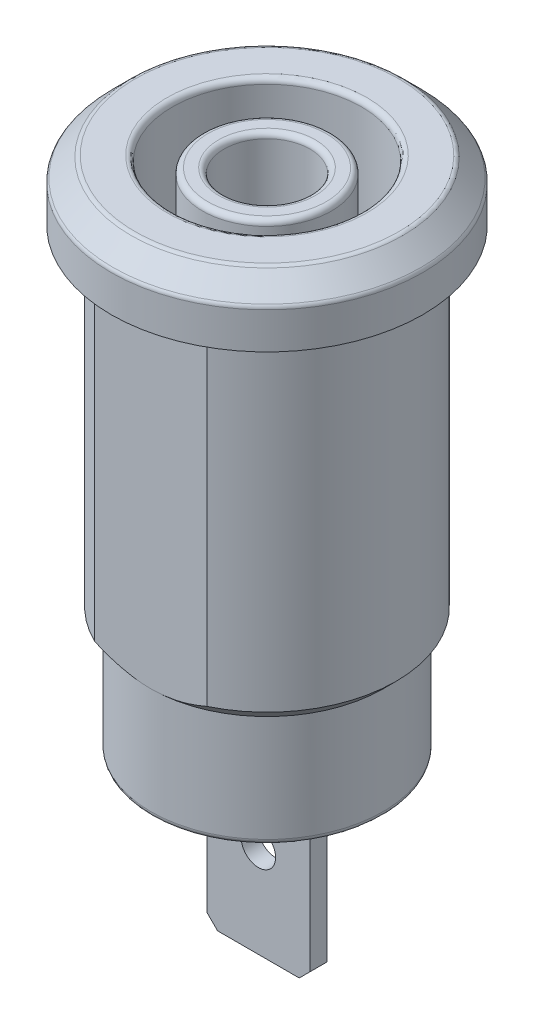
ISO-10303-21;
HEADER;
FILE_DESCRIPTION(('STEP AP214'),'2;1');
FILE_NAME('part.step','',(''),(''),'','','');
FILE_SCHEMA(('AUTOMOTIVE_DESIGN { 1 0 10303 214 1 1 1 1 }'));
ENDSEC;
DATA;
#1=APPLICATION_CONTEXT('core data for automotive mechanical design processes');
#2=APPLICATION_PROTOCOL_DEFINITION('international standard','automotive_design',2000,#1);
#3=PRODUCT_CONTEXT('',#1,'mechanical');
#4=PRODUCT('Part','Part','',(#3));
#5=PRODUCT_RELATED_PRODUCT_CATEGORY('part','',(#4));
#6=PRODUCT_DEFINITION_FORMATION('','',#4);
#7=PRODUCT_DEFINITION_CONTEXT('part definition',#1,'design');
#8=PRODUCT_DEFINITION('design','',#6,#7);
#9=PRODUCT_DEFINITION_SHAPE('','',#8);
#10=(LENGTH_UNIT() NAMED_UNIT(*) SI_UNIT(.MILLI.,.METRE.));
#11=(NAMED_UNIT(*) PLANE_ANGLE_UNIT() SI_UNIT($,.RADIAN.));
#12=(NAMED_UNIT(*) SI_UNIT($,.STERADIAN.) SOLID_ANGLE_UNIT());
#13=UNCERTAINTY_MEASURE_WITH_UNIT(LENGTH_MEASURE(1.E-05),#10,'distance_accuracy_value','');
#14=(GEOMETRIC_REPRESENTATION_CONTEXT(3) GLOBAL_UNCERTAINTY_ASSIGNED_CONTEXT((#13)) GLOBAL_UNIT_ASSIGNED_CONTEXT((#10,
#11,#12)) REPRESENTATION_CONTEXT('',''));
#15=CARTESIAN_POINT('',(0.,0.,0.));
#16=DIRECTION('',(0.,0.,1.));
#17=DIRECTION('',(1.,0.,0.));
#18=AXIS2_PLACEMENT_3D('',#15,#16,#17);
#19=CARTESIAN_POINT('',(0.,-24.,0.));
#20=DIRECTION('',(0.,-1.,0.));
#21=DIRECTION('',(0.,0.,-1.));
#22=AXIS2_PLACEMENT_3D('',#19,#20,#21);
#23=CYLINDRICAL_SURFACE('',#22,6.);
#24=DIRECTION('',(0.,-1.,0.));
#25=VECTOR('',#24,1.);
#26=CARTESIAN_POINT('',(2.6153393661244,17.911157620954,-5.4));
#27=LINE('',#26,#25);
#28=CARTESIAN_POINT('',(2.6153393661244,-2.8,-5.4));
#29=VERTEX_POINT('',#28);
#30=CARTESIAN_POINT('',(2.6153393661244,-18.2,-5.4));
#31=VERTEX_POINT('',#30);
#32=EDGE_CURVE('E155',#29,#31,#27,.T.);
#33=ORIENTED_EDGE('',*,*,#32,.F.);
#34=CARTESIAN_POINT('',(0.,-2.8,0.));
#35=DIRECTION('',(0.,-1.,0.));
#36=DIRECTION('',(0.,0.,-1.));
#37=AXIS2_PLACEMENT_3D('',#34,#35,#36);
#38=CIRCLE('',#37,6.);
#39=CARTESIAN_POINT('',(2.6153393661244,-2.8,5.4));
#40=VERTEX_POINT('',#39);
#41=EDGE_CURVE('E150',#29,#40,#38,.T.);
#42=ORIENTED_EDGE('',*,*,#41,.T.);
#43=DIRECTION('',(0.,-1.,0.));
#44=VECTOR('',#43,1.);
#45=CARTESIAN_POINT('',(2.6153393661244,17.911157620954,5.4));
#46=LINE('',#45,#44);
#47=CARTESIAN_POINT('',(2.6153393661244,-18.2,5.4));
#48=VERTEX_POINT('',#47);
#49=EDGE_CURVE('E132',#40,#48,#46,.T.);
#50=ORIENTED_EDGE('',*,*,#49,.T.);
#51=CARTESIAN_POINT('',(0.,-18.2,0.));
#52=DIRECTION('',(0.,-1.,0.));
#53=DIRECTION('',(0.,0.,-1.));
#54=AXIS2_PLACEMENT_3D('',#51,#52,#53);
#55=CIRCLE('',#54,6.);
#56=EDGE_CURVE('E161',#31,#48,#55,.T.);
#57=ORIENTED_EDGE('',*,*,#56,.F.);
#58=EDGE_LOOP('',(#33,#42,#50,#57));
#59=FACE_BOUND('',#58,.T.);
#60=ADVANCED_FACE('F48',(#59),#23,.T.);
#61=DIRECTION('',(0.,-1.,0.));
#62=VECTOR('',#61,1.);
#63=CARTESIAN_POINT('',(-2.6153393661244,17.911157620954,-5.4));
#64=LINE('',#63,#62);
#65=CARTESIAN_POINT('',(-2.6153393661244,-2.8,-5.4));
#66=VERTEX_POINT('',#65);
#67=CARTESIAN_POINT('',(-2.6153393661244,-18.2,-5.4));
#68=VERTEX_POINT('',#67);
#69=EDGE_CURVE('E683',#66,#68,#64,.T.);
#70=ORIENTED_EDGE('',*,*,#69,.T.);
#71=CARTESIAN_POINT('',(-2.6153393661244,-18.2,5.4));
#72=VERTEX_POINT('',#71);
#73=EDGE_CURVE('E292',#72,#68,#55,.T.);
#74=ORIENTED_EDGE('',*,*,#73,.F.);
#75=DIRECTION('',(0.,-1.,0.));
#76=VECTOR('',#75,1.);
#77=CARTESIAN_POINT('',(-2.6153393661244,17.911157620954,5.4));
#78=LINE('',#77,#76);
#79=CARTESIAN_POINT('',(-2.6153393661244,-2.8,5.4));
#80=VERTEX_POINT('',#79);
#81=EDGE_CURVE('E143',#80,#72,#78,.T.);
#82=ORIENTED_EDGE('',*,*,#81,.F.);
#83=EDGE_CURVE('E152',#80,#66,#38,.T.);
#84=ORIENTED_EDGE('',*,*,#83,.T.);
#85=EDGE_LOOP('',(#70,#74,#82,#84));
#86=FACE_BOUND('',#85,.T.);
#87=ADVANCED_FACE('F384',(#86),#23,.T.);
#88=CARTESIAN_POINT('',(0.,-18.2,0.));
#89=DIRECTION('',(0.,1.,0.));
#90=DIRECTION('',(0.,0.,1.));
#91=AXIS2_PLACEMENT_3D('',#88,#89,#90);
#92=CONICAL_SURFACE('',#91,6.,0.785398163397453);
#93=CARTESIAN_POINT('',(7.88051799855966,-14.6468558094404,-5.4));
#94=CARTESIAN_POINT('',(7.74017221020052,-14.7626199716313,-5.4));
#95=CARTESIAN_POINT('',(7.59934854294888,-14.8778077851178,-5.4));
#96=CARTESIAN_POINT('',(7.31659914119185,-15.1068319058643,-5.4));
#97=CARTESIAN_POINT('',(7.17467336980966,-15.2206681675757,-5.4));
#98=CARTESIAN_POINT('',(6.88940206289736,-15.446925967279,-5.4));
#99=CARTESIAN_POINT('',(6.74605495489742,-15.5593455277286,-5.4));
#100=CARTESIAN_POINT('',(6.45794610624799,-15.7823531493775,-5.4));
#101=CARTESIAN_POINT('',(6.31318435892511,-15.8929412019301,-5.4));
#102=CARTESIAN_POINT('',(5.86985497728603,-16.2265139061073,-5.4));
#103=CARTESIAN_POINT('',(5.56871545140075,-16.4461307639529,-5.4));
#104=CARTESIAN_POINT('',(5.11042409538005,-16.7659850586157,-5.4));
#105=CARTESIAN_POINT('',(4.95659525168662,-16.8709876096033,-5.4));
#106=CARTESIAN_POINT('',(4.64637357979973,-17.0771263411528,-5.4));
#107=CARTESIAN_POINT('',(4.48998089378888,-17.1782627350901,-5.4));
#108=CARTESIAN_POINT('',(4.13062218153672,-17.4031402386419,-5.4));
#109=CARTESIAN_POINT('',(3.9267261894353,-17.5254069715341,-5.4));
#110=CARTESIAN_POINT('',(3.51329540566441,-17.759947729394,-5.4));
#111=CARTESIAN_POINT('',(3.30376234083575,-17.8722247701783,-5.4));
#112=CARTESIAN_POINT('',(2.87913300479671,-18.0831702072468,-5.4));
#113=CARTESIAN_POINT('',(2.66406812203023,-18.1819011021161,-5.4));
#114=CARTESIAN_POINT('',(2.22685748405029,-18.3622499956522,-5.4));
#115=CARTESIAN_POINT('',(2.0047156813708,-18.4438773602718,-5.4));
#116=CARTESIAN_POINT('',(1.62249657198403,-18.5634776025891,-5.4));
#117=CARTESIAN_POINT('',(1.46421343755746,-18.6071667328493,-5.4));
#118=CARTESIAN_POINT('',(1.14472131497074,-18.6821833970467,-5.4));
#119=CARTESIAN_POINT('',(0.983512735568519,-18.7135126442687,-5.4));
#120=CARTESIAN_POINT('',(0.659439725938091,-18.7622348650963,-5.4));
#121=CARTESIAN_POINT('',(0.496581268896233,-18.7796670061468,-5.4));
#122=CARTESIAN_POINT('',(0.169946440350035,-18.7997849861937,-5.4));
#123=CARTESIAN_POINT('',(0.00617010289977787,-18.802471368691,-5.4));
#124=CARTESIAN_POINT('',(-0.321096828992566,-18.7929379954228,-5.4));
#125=CARTESIAN_POINT('',(-0.484587003353726,-18.7807040560021,-5.4));
#126=CARTESIAN_POINT('',(-0.809860093596026,-18.7419987942841,-5.4));
#127=CARTESIAN_POINT('',(-0.971642859631856,-18.7155262328008,-5.4));
#128=CARTESIAN_POINT('',(-1.29306988062594,-18.6495780552557,-5.4));
#129=CARTESIAN_POINT('',(-1.45270504228862,-18.6100587244377,-5.4));
#130=CARTESIAN_POINT('',(-1.76870930749127,-18.5197367339798,-5.4));
#131=CARTESIAN_POINT('',(-1.92507838643421,-18.4689339893975,-5.4));
#132=CARTESIAN_POINT('',(-2.26242054167032,-18.3476962147427,-5.4));
#133=CARTESIAN_POINT('',(-2.44270982974381,-18.2753715460032,-5.4));
#134=CARTESIAN_POINT('',(-2.79863515154502,-18.1199753063737,-5.4));
#135=CARTESIAN_POINT('',(-2.97426897972715,-18.0368987476117,-5.4));
#136=CARTESIAN_POINT('',(-3.32150616692736,-17.8620299132164,-5.4));
#137=CARTESIAN_POINT('',(-3.49310169661547,-17.7702222086563,-5.4));
#138=CARTESIAN_POINT('',(-3.83239379345227,-17.5797630721267,-5.4));
#139=CARTESIAN_POINT('',(-4.00009091979759,-17.4811126298852,-5.4));
#140=CARTESIAN_POINT('',(-4.33318972627573,-17.2776423519917,-5.4));
#141=CARTESIAN_POINT('',(-4.49856925673257,-17.1727864262386,-5.4));
#142=CARTESIAN_POINT('',(-4.82637211814564,-16.958558008334,-5.4));
#143=CARTESIAN_POINT('',(-4.9887953626857,-16.849185384458,-5.4));
#144=CARTESIAN_POINT('',(-5.3109328562108,-16.6268606702301,-5.4));
#145=CARTESIAN_POINT('',(-5.47064958346763,-16.5139121602079,-5.4));
#146=CARTESIAN_POINT('',(-5.7878903728073,-16.2849749965794,-5.4));
#147=CARTESIAN_POINT('',(-5.94541437741838,-16.168986263517,-5.4));
#148=CARTESIAN_POINT('',(-6.25403088070918,-15.9378723762329,-5.4));
#149=CARTESIAN_POINT('',(-6.40517755457747,-15.8228194223752,-5.4));
#150=CARTESIAN_POINT('',(-6.70592588927033,-15.590684955648,-5.4));
#151=CARTESIAN_POINT('',(-6.8555274022988,-15.4736032515427,-5.4));
#152=CARTESIAN_POINT('',(-7.15168747834554,-15.239054723029,-5.4));
#153=CARTESIAN_POINT('',(-7.29826132740584,-15.1216071707167,-5.4));
#154=CARTESIAN_POINT('',(-7.5902323752724,-14.8852624613367,-5.4));
#155=CARTESIAN_POINT('',(-7.73562959259385,-14.7663653271533,-5.4));
#156=CARTESIAN_POINT('',(-7.88051799855967,-14.6468558094404,-5.4));
#157=B_SPLINE_CURVE_WITH_KNOTS('',3,(#93,#94,#95,#96,#97,#98,#99,#100,#101,#102,#103,#104,#105,
#106,#107,#108,#109,#110,#111,#112,#113,#114,#115,#116,#117,#118,#119,#120,#121,#122,#123,#124,
#125,#126,#127,#128,#129,#130,#131,#132,#133,#134,#135,#136,#137,#138,#139,#140,#141,#142,#143,
#144,#145,#146,#147,#148,#149,#150,#151,#152,#153,#154,#155,#156),.UNSPECIFIED.,.F.,.F.,(4,2,2,
2,2,2,2,2,2,2,2,2,2,2,2,2,2,2,2,2,2,2,2,2,2,2,2,2,2,2,2,4),(0.,0.545788995403366,
1.0915963324797,1.63809595955851,2.18459816593152,3.30245890012273,3.8611620670288,
4.41983435413523,5.13285329767226,5.8456562502883,6.5550511737132,7.26405660886146,
7.75624619720894,8.24836753592784,8.7390969329762,9.22980824253735,9.72098639916365,
10.2122073098999,10.7050911085736,11.1979786178446,11.7802986021396,12.3628897033444,
12.9465301471928,13.5300863490771,14.1174544290453,14.704839651078,15.2916542824447,
15.8784842655065,16.4483264707753,17.0182226864039,17.5816847034062,18.145137836599),.UNSPECIFIED.);
#158=CARTESIAN_POINT('',(0.,-18.8,-5.4));
#159=VERTEX_POINT('',#158);
#160=EDGE_CURVE('E71',#31,#159,#157,.T.);
#161=ORIENTED_EDGE('',*,*,#160,.F.);
#162=ORIENTED_EDGE('',*,*,#56,.T.);
#163=CARTESIAN_POINT('',(-7.88051799855966,-14.6468558094404,5.4));
#164=CARTESIAN_POINT('',(-7.74017221020052,-14.7626199716313,5.4));
#165=CARTESIAN_POINT('',(-7.59934854294887,-14.8778077851178,5.4));
#166=CARTESIAN_POINT('',(-7.31659914119185,-15.1068319058643,5.4));
#167=CARTESIAN_POINT('',(-7.17467336980965,-15.2206681675757,5.4));
#168=CARTESIAN_POINT('',(-6.88940206289736,-15.446925967279,5.4));
#169=CARTESIAN_POINT('',(-6.74605495489742,-15.5593455277286,5.4));
#170=CARTESIAN_POINT('',(-6.45794610624799,-15.7823531493775,5.4));
#171=CARTESIAN_POINT('',(-6.31318435892511,-15.8929412019301,5.4));
#172=CARTESIAN_POINT('',(-5.86985497728603,-16.2265139061073,5.4));
#173=CARTESIAN_POINT('',(-5.56871545140075,-16.4461307639529,5.4));
#174=CARTESIAN_POINT('',(-5.11042409538005,-16.7659850586157,5.4));
#175=CARTESIAN_POINT('',(-4.95659525168662,-16.8709876096033,5.4));
#176=CARTESIAN_POINT('',(-4.64637357979973,-17.0771263411528,5.4));
#177=CARTESIAN_POINT('',(-4.48998089378888,-17.1782627350902,5.4));
#178=CARTESIAN_POINT('',(-4.13062218153671,-17.4031402386419,5.4));
#179=CARTESIAN_POINT('',(-3.9267261894353,-17.5254069715341,5.4));
#180=CARTESIAN_POINT('',(-3.51329540566441,-17.759947729394,5.4));
#181=CARTESIAN_POINT('',(-3.30376234083574,-17.8722247701783,5.4));
#182=CARTESIAN_POINT('',(-2.87913300479671,-18.0831702072468,5.4));
#183=CARTESIAN_POINT('',(-2.66406812203022,-18.1819011021161,5.4));
#184=CARTESIAN_POINT('',(-2.22685748405029,-18.3622499956522,5.4));
#185=CARTESIAN_POINT('',(-2.0047156813708,-18.4438773602718,5.4));
#186=CARTESIAN_POINT('',(-1.62249657198403,-18.5634776025891,5.4));
#187=CARTESIAN_POINT('',(-1.46421343755746,-18.6071667328493,5.4));
#188=CARTESIAN_POINT('',(-1.14472131497074,-18.6821833970467,5.4));
#189=CARTESIAN_POINT('',(-0.983512735568518,-18.7135126442687,5.4));
#190=CARTESIAN_POINT('',(-0.659439725938091,-18.7622348650963,5.4));
#191=CARTESIAN_POINT('',(-0.496581268896233,-18.7796670061468,5.4));
#192=CARTESIAN_POINT('',(-0.169946440350035,-18.7997849861937,5.4));
#193=CARTESIAN_POINT('',(-0.00617010289977773,-18.802471368691,5.4));
#194=CARTESIAN_POINT('',(0.321096828992566,-18.7929379954228,5.4));
#195=CARTESIAN_POINT('',(0.484587003353726,-18.7807040560021,5.4));
#196=CARTESIAN_POINT('',(0.809860093596027,-18.7419987942841,5.4));
#197=CARTESIAN_POINT('',(0.971642859631856,-18.7155262328008,5.4));
#198=CARTESIAN_POINT('',(1.29306988062594,-18.6495780552557,5.4));
#199=CARTESIAN_POINT('',(1.45270504228862,-18.6100587244377,5.4));
#200=CARTESIAN_POINT('',(1.76870930749127,-18.5197367339798,5.4));
#201=CARTESIAN_POINT('',(1.92507838643421,-18.4689339893975,5.4));
#202=CARTESIAN_POINT('',(2.26242054167032,-18.3476962147427,5.4));
#203=CARTESIAN_POINT('',(2.44270982974381,-18.2753715460032,5.4));
#204=CARTESIAN_POINT('',(2.79863515154502,-18.1199753063737,5.4));
#205=CARTESIAN_POINT('',(2.97426897972715,-18.0368987476117,5.4));
#206=CARTESIAN_POINT('',(3.32150616692736,-17.8620299132164,5.4));
#207=CARTESIAN_POINT('',(3.49310169661547,-17.7702222086563,5.4));
#208=CARTESIAN_POINT('',(3.83239379345227,-17.5797630721267,5.4));
#209=CARTESIAN_POINT('',(4.00009091979759,-17.4811126298852,5.4));
#210=CARTESIAN_POINT('',(4.33318972627573,-17.2776423519917,5.4));
#211=CARTESIAN_POINT('',(4.49856925673257,-17.1727864262386,5.4));
#212=CARTESIAN_POINT('',(4.82637211814564,-16.958558008334,5.4));
#213=CARTESIAN_POINT('',(4.9887953626857,-16.849185384458,5.4));
#214=CARTESIAN_POINT('',(5.3109328562108,-16.6268606702301,5.4));
#215=CARTESIAN_POINT('',(5.47064958346763,-16.5139121602079,5.4));
#216=CARTESIAN_POINT('',(5.7878903728073,-16.2849749965794,5.4));
#217=CARTESIAN_POINT('',(5.94541437741838,-16.168986263517,5.4));
#218=CARTESIAN_POINT('',(6.25403088070918,-15.9378723762329,5.4));
#219=CARTESIAN_POINT('',(6.40517755457747,-15.8228194223752,5.4));
#220=CARTESIAN_POINT('',(6.70592588927032,-15.590684955648,5.4));
#221=CARTESIAN_POINT('',(6.8555274022988,-15.4736032515427,5.4));
#222=CARTESIAN_POINT('',(7.15168747834553,-15.239054723029,5.4));
#223=CARTESIAN_POINT('',(7.29826132740583,-15.1216071707167,5.4));
#224=CARTESIAN_POINT('',(7.59023237527239,-14.8852624613367,5.4));
#225=CARTESIAN_POINT('',(7.73562959259385,-14.7663653271533,5.4));
#226=CARTESIAN_POINT('',(7.88051799855966,-14.6468558094404,5.4));
#227=B_SPLINE_CURVE_WITH_KNOTS('',3,(#163,#164,#165,#166,#167,#168,#169,#170,#171,#172,#173,
#174,#175,#176,#177,#178,#179,#180,#181,#182,#183,#184,#185,#186,#187,#188,#189,#190,#191,#192,
#193,#194,#195,#196,#197,#198,#199,#200,#201,#202,#203,#204,#205,#206,#207,#208,#209,#210,#211,
#212,#213,#214,#215,#216,#217,#218,#219,#220,#221,#222,#223,#224,#225,#226),.UNSPECIFIED.,.F.,
.F.,(4,2,2,2,2,2,2,2,2,2,2,2,2,2,2,2,2,2,2,2,2,2,2,2,2,2,2,2,2,2,2,4),(0.,0.545788995403366,
1.0915963324797,1.63809595955851,2.18459816593151,3.30245890012272,3.8611620670288,
4.41983435413523,5.13285329767226,5.8456562502883,6.5550511737132,7.26405660886146,
7.75624619720893,8.24836753592783,8.7390969329762,9.22980824253734,9.72098639916364,
10.2122073098999,10.7050911085736,11.1979786178446,11.7802986021396,12.3628897033444,
12.9465301471928,13.5300863490771,14.1174544290453,14.704839651078,15.2916542824447,
15.8784842655065,16.4483264707753,17.0182226864039,17.5816847034062,18.145137836599),.UNSPECIFIED.);
#228=CARTESIAN_POINT('',(0.,-18.8,5.4));
#229=VERTEX_POINT('',#228);
#230=EDGE_CURVE('E137',#229,#48,#227,.T.);
#231=ORIENTED_EDGE('',*,*,#230,.F.);
#232=CARTESIAN_POINT('',(0.,-18.8,0.));
#233=DIRECTION('',(0.,-1.,0.));
#234=DIRECTION('',(0.,0.,-1.));
#235=AXIS2_PLACEMENT_3D('',#232,#233,#234);
#236=CIRCLE('',#235,5.4);
#237=EDGE_CURVE('E290',#159,#229,#236,.T.);
#238=ORIENTED_EDGE('',*,*,#237,.F.);
#239=EDGE_LOOP('',(#161,#162,#231,#238));
#240=FACE_BOUND('',#239,.T.);
#241=ADVANCED_FACE('F299',(#240),#92,.T.);
#242=EDGE_CURVE('E301',#159,#68,#157,.T.);
#243=ORIENTED_EDGE('',*,*,#242,.F.);
#244=EDGE_CURVE('E239',#229,#159,#236,.T.);
#245=ORIENTED_EDGE('',*,*,#244,.F.);
#246=EDGE_CURVE('E63',#72,#229,#227,.T.);
#247=ORIENTED_EDGE('',*,*,#246,.F.);
#248=ORIENTED_EDGE('',*,*,#73,.T.);
#249=EDGE_LOOP('',(#243,#245,#247,#248));
#250=FACE_BOUND('',#249,.T.);
#251=ADVANCED_FACE('F227',(#250),#92,.T.);
#252=CARTESIAN_POINT('',(-5.4,-24.,0.));
#253=DIRECTION('',(0.,1.,0.));
#254=DIRECTION('',(0.,0.,1.));
#255=AXIS2_PLACEMENT_3D('',#252,#253,#254);
#256=PLANE('',#255);
#257=CARTESIAN_POINT('',(0.,-24.,0.));
#258=DIRECTION('',(0.,1.,0.));
#259=DIRECTION('',(0.,0.,1.));
#260=AXIS2_PLACEMENT_3D('',#257,#258,#259);
#261=CIRCLE('',#260,5.15);
#262=CARTESIAN_POINT('',(0.,-24.,5.15));
#263=VERTEX_POINT('',#262);
#264=EDGE_CURVE('E209',#263,#263,#261,.F.);
#265=ORIENTED_EDGE('',*,*,#264,.T.);
#266=EDGE_LOOP('',(#265));
#267=FACE_BOUND('',#266,.T.);
#268=DIRECTION('',(0.,0.,-1.));
#269=VECTOR('',#268,1.);
#270=CARTESIAN_POINT('',(-2.4,-24.,0.4));
#271=LINE('',#270,#269);
#272=CARTESIAN_POINT('',(-2.4,-24.,0.4));
#273=VERTEX_POINT('',#272);
#274=CARTESIAN_POINT('',(-2.4,-24.,-0.4));
#275=VERTEX_POINT('',#274);
#276=EDGE_CURVE('E230',#273,#275,#271,.T.);
#277=ORIENTED_EDGE('',*,*,#276,.F.);
#278=DIRECTION('',(-1.,0.,0.));
#279=VECTOR('',#278,1.);
#280=CARTESIAN_POINT('',(2.4,-24.,0.4));
#281=LINE('',#280,#279);
#282=CARTESIAN_POINT('',(2.4,-24.,0.4));
#283=VERTEX_POINT('',#282);
#284=EDGE_CURVE('E233',#283,#273,#281,.T.);
#285=ORIENTED_EDGE('',*,*,#284,.F.);
#286=DIRECTION('',(0.,0.,-1.));
#287=VECTOR('',#286,1.);
#288=CARTESIAN_POINT('',(2.4,-24.,0.4));
#289=LINE('',#288,#287);
#290=CARTESIAN_POINT('',(2.4,-24.,-0.4));
#291=VERTEX_POINT('',#290);
#292=EDGE_CURVE('E270',#283,#291,#289,.T.);
#293=ORIENTED_EDGE('',*,*,#292,.T.);
#294=DIRECTION('',(-1.,0.,0.));
#295=VECTOR('',#294,1.);
#296=CARTESIAN_POINT('',(2.4,-24.,-0.4));
#297=LINE('',#296,#295);
#298=EDGE_CURVE('E236',#291,#275,#297,.T.);
#299=ORIENTED_EDGE('',*,*,#298,.T.);
#300=EDGE_LOOP('',(#277,#285,#293,#299));
#301=FACE_BOUND('',#300,.T.);
#302=ADVANCED_FACE('F223',(#267,#301),#256,.F.);
#303=CARTESIAN_POINT('',(-4.4,0.,0.));
#304=DIRECTION('',(0.,-1.,0.));
#305=DIRECTION('',(0.,0.,-1.));
#306=AXIS2_PLACEMENT_3D('',#303,#304,#305);
#307=PLANE('',#306);
#308=CARTESIAN_POINT('',(0.,0.,0.));
#309=DIRECTION('',(0.,-1.,0.));
#310=DIRECTION('',(0.,0.,-1.));
#311=AXIS2_PLACEMENT_3D('',#308,#309,#310);
#312=CIRCLE('',#311,4.65);
#313=CARTESIAN_POINT('',(0.,0.,-4.65));
#314=VERTEX_POINT('',#313);
#315=EDGE_CURVE('E194',#314,#314,#312,.T.);
#316=ORIENTED_EDGE('',*,*,#315,.T.);
#317=EDGE_LOOP('',(#316));
#318=FACE_BOUND('',#317,.T.);
#319=CARTESIAN_POINT('',(0.,0.,0.));
#320=DIRECTION('',(0.,-1.,0.));
#321=DIRECTION('',(0.,0.,-1.));
#322=AXIS2_PLACEMENT_3D('',#319,#320,#321);
#323=CIRCLE('',#322,6.14644660940673);
#324=CARTESIAN_POINT('',(0.,0.,-6.14644660940673));
#325=VERTEX_POINT('',#324);
#326=EDGE_CURVE('E191',#325,#325,#323,.F.);
#327=ORIENTED_EDGE('',*,*,#326,.T.);
#328=EDGE_LOOP('',(#327));
#329=FACE_BOUND('',#328,.T.);
#330=ADVANCED_FACE('F226',(#318,#329),#307,.F.);
#331=CARTESIAN_POINT('',(0.,0.,0.));
#332=DIRECTION('',(0.,-1.,0.));
#333=DIRECTION('',(0.,0.,-1.));
#334=AXIS2_PLACEMENT_3D('',#331,#332,#333);
#335=CONICAL_SURFACE('',#334,6.25000000000001,0.785398163397445);
#336=CARTESIAN_POINT('',(0.,-0.0732233047033648,0.));
#337=DIRECTION('',(0.,1.,0.));
#338=DIRECTION('',(0.,0.,1.));
#339=AXIS2_PLACEMENT_3D('',#336,#337,#338);
#340=CIRCLE('',#339,6.32322330470337);
#341=CARTESIAN_POINT('',(0.,-0.0732233047033648,6.32322330470337));
#342=VERTEX_POINT('',#341);
#343=EDGE_CURVE('E200',#342,#342,#340,.F.);
#344=ORIENTED_EDGE('',*,*,#343,.T.);
#345=EDGE_LOOP('',(#344));
#346=FACE_BOUND('',#345,.T.);
#347=CARTESIAN_POINT('',(0.,-0.926776695296637,0.));
#348=DIRECTION('',(0.,1.,0.));
#349=DIRECTION('',(0.,0.,1.));
#350=AXIS2_PLACEMENT_3D('',#347,#348,#349);
#351=CIRCLE('',#350,7.17677669529664);
#352=CARTESIAN_POINT('',(0.,-0.926776695296637,7.17677669529664));
#353=VERTEX_POINT('',#352);
#354=EDGE_CURVE('E197',#353,#353,#351,.T.);
#355=ORIENTED_EDGE('',*,*,#354,.T.);
#356=EDGE_LOOP('',(#355));
#357=FACE_BOUND('',#356,.T.);
#358=ADVANCED_FACE('F392',(#346,#357),#335,.T.);
#359=CARTESIAN_POINT('',(0.,-24.,0.));
#360=DIRECTION('',(0.,-1.,0.));
#361=DIRECTION('',(0.,0.,-1.));
#362=AXIS2_PLACEMENT_3D('',#359,#360,#361);
#363=CYLINDRICAL_SURFACE('',#362,7.25);
#364=CARTESIAN_POINT('',(0.,-1.10355339059327,0.));
#365=DIRECTION('',(0.,1.,0.));
#366=DIRECTION('',(0.,0.,1.));
#367=AXIS2_PLACEMENT_3D('',#364,#365,#366);
#368=CIRCLE('',#367,7.25);
#369=CARTESIAN_POINT('',(0.,-1.10355339059327,7.25));
#370=VERTEX_POINT('',#369);
#371=EDGE_CURVE('E12',#370,#370,#368,.F.);
#372=ORIENTED_EDGE('',*,*,#371,.T.);
#373=EDGE_LOOP('',(#372));
#374=FACE_BOUND('',#373,.T.);
#375=CARTESIAN_POINT('',(0.,-2.8,0.));
#376=DIRECTION('',(0.,-1.,0.));
#377=DIRECTION('',(0.,0.,-1.));
#378=AXIS2_PLACEMENT_3D('',#375,#376,#377);
#379=CIRCLE('',#378,7.25);
#380=CARTESIAN_POINT('',(0.,-2.8,-7.25));
#381=VERTEX_POINT('',#380);
#382=EDGE_CURVE('E156',#381,#381,#379,.T.);
#383=ORIENTED_EDGE('',*,*,#382,.F.);
#384=EDGE_LOOP('',(#383));
#385=FACE_BOUND('',#384,.T.);
#386=ADVANCED_FACE('F381',(#374,#385),#363,.T.);
#387=CARTESIAN_POINT('',(-7.25,-2.8,0.));
#388=DIRECTION('',(0.,1.,0.));
#389=DIRECTION('',(0.,0.,1.));
#390=AXIS2_PLACEMENT_3D('',#387,#388,#389);
#391=PLANE('',#390);
#392=ORIENTED_EDGE('',*,*,#41,.F.);
#393=DIRECTION('',(1.,0.,0.));
#394=VECTOR('',#393,1.);
#395=CARTESIAN_POINT('',(-2.6153393661244,-2.8,-5.4));
#396=LINE('',#395,#394);
#397=EDGE_CURVE('E142',#66,#29,#396,.T.);
#398=ORIENTED_EDGE('',*,*,#397,.F.);
#399=ORIENTED_EDGE('',*,*,#83,.F.);
#400=DIRECTION('',(-1.,0.,0.));
#401=VECTOR('',#400,1.);
#402=CARTESIAN_POINT('',(2.6153393661244,-2.8,5.4));
#403=LINE('',#402,#401);
#404=EDGE_CURVE('E135',#40,#80,#403,.T.);
#405=ORIENTED_EDGE('',*,*,#404,.F.);
#406=EDGE_LOOP('',(#392,#398,#399,#405));
#407=FACE_BOUND('',#406,.T.);
#408=ORIENTED_EDGE('',*,*,#382,.T.);
#409=EDGE_LOOP('',(#408));
#410=FACE_BOUND('',#409,.T.);
#411=ADVANCED_FACE('F148',(#407,#410),#391,.F.);
#412=CARTESIAN_POINT('',(0.,-24.,0.));
#413=DIRECTION('',(0.,-1.,0.));
#414=DIRECTION('',(0.,0.,-1.));
#415=AXIS2_PLACEMENT_3D('',#412,#413,#414);
#416=CYLINDRICAL_SURFACE('',#415,5.4);
#417=CARTESIAN_POINT('',(0.,-23.75,0.));
#418=DIRECTION('',(0.,1.,0.));
#419=DIRECTION('',(0.,0.,1.));
#420=AXIS2_PLACEMENT_3D('',#417,#418,#419);
#421=CIRCLE('',#420,5.4);
#422=CARTESIAN_POINT('',(0.,-23.75,5.4));
#423=VERTEX_POINT('',#422);
#424=EDGE_CURVE('E56',#423,#423,#421,.T.);
#425=ORIENTED_EDGE('',*,*,#424,.T.);
#426=EDGE_LOOP('',(#425));
#427=FACE_BOUND('',#426,.T.);
#428=ORIENTED_EDGE('',*,*,#244,.T.);
#429=ORIENTED_EDGE('',*,*,#237,.T.);
#430=EDGE_LOOP('',(#428,#429));
#431=FACE_BOUND('',#430,.T.);
#432=ADVANCED_FACE('F214',(#427,#431),#416,.T.);
#433=CARTESIAN_POINT('',(0.,-21.1547005383792,0.));
#434=DIRECTION('',(0.,1.,0.));
#435=DIRECTION('',(0.,0.,1.));
#436=AXIS2_PLACEMENT_3D('',#433,#434,#435);
#437=CONICAL_SURFACE('',#436,0.,1.0471975511966);
#438=CARTESIAN_POINT('',(0.,-20.0721687836487,0.));
#439=DIRECTION('',(0.,1.,0.));
#440=DIRECTION('',(0.,0.,1.));
#441=AXIS2_PLACEMENT_3D('',#438,#439,#440);
#442=CIRCLE('',#441,1.875);
#443=CARTESIAN_POINT('',(0.,-20.0721687836487,1.875));
#444=VERTEX_POINT('',#443);
#445=EDGE_CURVE('E170',#444,#444,#442,.T.);
#446=ORIENTED_EDGE('',*,*,#445,.T.);
#447=EDGE_LOOP('',(#446));
#448=FACE_BOUND('',#447,.T.);
#449=CARTESIAN_POINT('',(0.,-21.1547005383792,0.));
#450=VERTEX_POINT('',#449);
#451=VERTEX_LOOP('',#450);
#452=FACE_BOUND('',#451,.T.);
#453=ADVANCED_FACE('F372',(#448,#452),#437,.F.);
#454=CARTESIAN_POINT('',(0.,-24.,0.));
#455=DIRECTION('',(0.,-1.,0.));
#456=DIRECTION('',(0.,0.,-1.));
#457=AXIS2_PLACEMENT_3D('',#454,#455,#456);
#458=CYLINDRICAL_SURFACE('',#457,2.);
#459=CARTESIAN_POINT('',(0.,-19.8556624327026,0.));
#460=DIRECTION('',(0.,-1.,0.));
#461=DIRECTION('',(0.,0.,-1.));
#462=AXIS2_PLACEMENT_3D('',#459,#460,#461);
#463=CIRCLE('',#462,2.);
#464=CARTESIAN_POINT('',(0.,-19.8556624327026,-2.));
#465=VERTEX_POINT('',#464);
#466=EDGE_CURVE('E167',#465,#465,#463,.T.);
#467=ORIENTED_EDGE('',*,*,#466,.T.);
#468=EDGE_LOOP('',(#467));
#469=FACE_BOUND('',#468,.T.);
#470=CARTESIAN_POINT('',(0.,-0.750000000000001,0.));
#471=DIRECTION('',(0.,-1.,0.));
#472=DIRECTION('',(0.,0.,-1.));
#473=AXIS2_PLACEMENT_3D('',#470,#471,#472);
#474=CIRCLE('',#473,2.);
#475=CARTESIAN_POINT('',(0.,-0.750000000000001,-2.));
#476=VERTEX_POINT('',#475);
#477=EDGE_CURVE('E159',#476,#476,#474,.F.);
#478=ORIENTED_EDGE('',*,*,#477,.T.);
#479=EDGE_LOOP('',(#478));
#480=FACE_BOUND('',#479,.T.);
#481=ADVANCED_FACE('F368',(#469,#480),#458,.F.);
#482=CARTESIAN_POINT('',(-3.,-0.5,0.));
#483=DIRECTION('',(0.,-1.,0.));
#484=DIRECTION('',(0.,0.,-1.));
#485=AXIS2_PLACEMENT_3D('',#482,#483,#484);
#486=PLANE('',#485);
#487=CARTESIAN_POINT('',(0.,-0.5,0.));
#488=DIRECTION('',(0.,-1.,0.));
#489=DIRECTION('',(0.,0.,-1.));
#490=AXIS2_PLACEMENT_3D('',#487,#488,#489);
#491=CIRCLE('',#490,2.25);
#492=CARTESIAN_POINT('',(0.,-0.5,-2.25));
#493=VERTEX_POINT('',#492);
#494=EDGE_CURVE('E206',#493,#493,#491,.T.);
#495=ORIENTED_EDGE('',*,*,#494,.T.);
#496=EDGE_LOOP('',(#495));
#497=FACE_BOUND('',#496,.T.);
#498=CARTESIAN_POINT('',(0.,-0.5,0.));
#499=DIRECTION('',(0.,-1.,0.));
#500=DIRECTION('',(0.,0.,-1.));
#501=AXIS2_PLACEMENT_3D('',#498,#499,#500);
#502=CIRCLE('',#501,2.75);
#503=CARTESIAN_POINT('',(0.,-0.5,-2.75));
#504=VERTEX_POINT('',#503);
#505=EDGE_CURVE('E203',#504,#504,#502,.F.);
#506=ORIENTED_EDGE('',*,*,#505,.T.);
#507=EDGE_LOOP('',(#506));
#508=FACE_BOUND('',#507,.T.);
#509=ADVANCED_FACE('F364',(#497,#508),#486,.F.);
#510=CARTESIAN_POINT('',(0.,-24.,0.));
#511=DIRECTION('',(0.,-1.,0.));
#512=DIRECTION('',(0.,0.,-1.));
#513=AXIS2_PLACEMENT_3D('',#510,#511,#512);
#514=CYLINDRICAL_SURFACE('',#513,3.);
#515=CARTESIAN_POINT('',(0.,-21.25,0.));
#516=DIRECTION('',(0.,-1.,0.));
#517=DIRECTION('',(0.,0.,-1.));
#518=AXIS2_PLACEMENT_3D('',#515,#516,#517);
#519=CIRCLE('',#518,3.);
#520=CARTESIAN_POINT('',(0.,-21.25,-3.));
#521=VERTEX_POINT('',#520);
#522=EDGE_CURVE('E182',#521,#521,#519,.F.);
#523=ORIENTED_EDGE('',*,*,#522,.T.);
#524=EDGE_LOOP('',(#523));
#525=FACE_BOUND('',#524,.T.);
#526=CARTESIAN_POINT('',(0.,-0.750000000000001,0.));
#527=DIRECTION('',(0.,-1.,0.));
#528=DIRECTION('',(0.,0.,-1.));
#529=AXIS2_PLACEMENT_3D('',#526,#527,#528);
#530=CIRCLE('',#529,3.);
#531=CARTESIAN_POINT('',(0.,-0.750000000000001,-3.));
#532=VERTEX_POINT('',#531);
#533=EDGE_CURVE('E179',#532,#532,#530,.T.);
#534=ORIENTED_EDGE('',*,*,#533,.T.);
#535=EDGE_LOOP('',(#534));
#536=FACE_BOUND('',#535,.T.);
#537=ADVANCED_FACE('F360',(#525,#536),#514,.T.);
#538=CARTESIAN_POINT('',(-4.4,-21.5,0.));
#539=DIRECTION('',(0.,-1.,0.));
#540=DIRECTION('',(0.,0.,-1.));
#541=AXIS2_PLACEMENT_3D('',#538,#539,#540);
#542=PLANE('',#541);
#543=CARTESIAN_POINT('',(0.,-21.5,0.));
#544=DIRECTION('',(0.,-1.,0.));
#545=DIRECTION('',(0.,0.,-1.));
#546=AXIS2_PLACEMENT_3D('',#543,#544,#545);
#547=CIRCLE('',#546,3.25);
#548=CARTESIAN_POINT('',(0.,-21.5,-3.25));
#549=VERTEX_POINT('',#548);
#550=EDGE_CURVE('E176',#549,#549,#547,.T.);
#551=ORIENTED_EDGE('',*,*,#550,.T.);
#552=EDGE_LOOP('',(#551));
#553=FACE_BOUND('',#552,.T.);
#554=CARTESIAN_POINT('',(0.,-21.5,0.));
#555=DIRECTION('',(0.,-1.,0.));
#556=DIRECTION('',(0.,0.,-1.));
#557=AXIS2_PLACEMENT_3D('',#554,#555,#556);
#558=CIRCLE('',#557,4.15);
#559=CARTESIAN_POINT('',(0.,-21.5,-4.15));
#560=VERTEX_POINT('',#559);
#561=EDGE_CURVE('E173',#560,#560,#558,.F.);
#562=ORIENTED_EDGE('',*,*,#561,.T.);
#563=EDGE_LOOP('',(#562));
#564=FACE_BOUND('',#563,.T.);
#565=ADVANCED_FACE('F356',(#553,#564),#542,.F.);
#566=CARTESIAN_POINT('',(0.,-24.,0.));
#567=DIRECTION('',(0.,-1.,0.));
#568=DIRECTION('',(0.,0.,-1.));
#569=AXIS2_PLACEMENT_3D('',#566,#567,#568);
#570=CYLINDRICAL_SURFACE('',#569,4.4);
#571=CARTESIAN_POINT('',(0.,-21.25,0.));
#572=DIRECTION('',(0.,-1.,0.));
#573=DIRECTION('',(0.,0.,-1.));
#574=AXIS2_PLACEMENT_3D('',#571,#572,#573);
#575=CIRCLE('',#574,4.4);
#576=CARTESIAN_POINT('',(0.,-21.25,-4.4));
#577=VERTEX_POINT('',#576);
#578=EDGE_CURVE('E188',#577,#577,#575,.T.);
#579=ORIENTED_EDGE('',*,*,#578,.T.);
#580=EDGE_LOOP('',(#579));
#581=FACE_BOUND('',#580,.T.);
#582=CARTESIAN_POINT('',(0.,-0.25,0.));
#583=DIRECTION('',(0.,-1.,0.));
#584=DIRECTION('',(0.,0.,-1.));
#585=AXIS2_PLACEMENT_3D('',#582,#583,#584);
#586=CIRCLE('',#585,4.4);
#587=CARTESIAN_POINT('',(0.,-0.25,-4.4));
#588=VERTEX_POINT('',#587);
#589=EDGE_CURVE('E185',#588,#588,#586,.F.);
#590=ORIENTED_EDGE('',*,*,#589,.T.);
#591=EDGE_LOOP('',(#590));
#592=FACE_BOUND('',#591,.T.);
#593=ADVANCED_FACE('F333',(#581,#592),#570,.F.);
#594=CARTESIAN_POINT('',(0.,0.,0.4));
#595=DIRECTION('',(0.,0.,1.));
#596=DIRECTION('',(1.,0.,0.));
#597=AXIS2_PLACEMENT_3D('',#594,#595,#596);
#598=PLANE('',#597);
#599=ORIENTED_EDGE('',*,*,#284,.T.);
#600=DIRECTION('',(0.,-1.,0.));
#601=VECTOR('',#600,1.);
#602=CARTESIAN_POINT('',(-2.4,-24.,0.4));
#603=LINE('',#602,#601);
#604=CARTESIAN_POINT('',(-2.4,-31.5,0.4));
#605=VERTEX_POINT('',#604);
#606=EDGE_CURVE('E243',#273,#605,#603,.T.);
#607=ORIENTED_EDGE('',*,*,#606,.T.);
#608=DIRECTION('',(0.707106781186547,-0.707106781186547,0.));
#609=VECTOR('',#608,1.);
#610=CARTESIAN_POINT('',(-2.4,-31.5,0.4));
#611=LINE('',#610,#609);
#612=CARTESIAN_POINT('',(-1.9,-32.,0.4));
#613=VERTEX_POINT('',#612);
#614=EDGE_CURVE('E248',#605,#613,#611,.T.);
#615=ORIENTED_EDGE('',*,*,#614,.T.);
#616=DIRECTION('',(1.,0.,0.));
#617=VECTOR('',#616,1.);
#618=CARTESIAN_POINT('',(-1.9,-32.,0.4));
#619=LINE('',#618,#617);
#620=CARTESIAN_POINT('',(1.89999999999999,-32.,0.4));
#621=VERTEX_POINT('',#620);
#622=EDGE_CURVE('E265',#613,#621,#619,.T.);
#623=ORIENTED_EDGE('',*,*,#622,.T.);
#624=DIRECTION('',(0.707106781186551,0.707106781186544,0.));
#625=VECTOR('',#624,1.);
#626=CARTESIAN_POINT('',(1.89999999999999,-32.,0.4));
#627=LINE('',#626,#625);
#628=CARTESIAN_POINT('',(2.4,-31.5,0.4));
#629=VERTEX_POINT('',#628);
#630=EDGE_CURVE('E267',#621,#629,#627,.T.);
#631=ORIENTED_EDGE('',*,*,#630,.T.);
#632=DIRECTION('',(0.,1.,0.));
#633=VECTOR('',#632,1.);
#634=CARTESIAN_POINT('',(2.4,-31.5,0.4));
#635=LINE('',#634,#633);
#636=EDGE_CURVE('E253',#629,#283,#635,.T.);
#637=ORIENTED_EDGE('',*,*,#636,.T.);
#638=EDGE_LOOP('',(#599,#607,#615,#623,#631,#637));
#639=FACE_BOUND('',#638,.T.);
#640=CARTESIAN_POINT('',(0.,-27.7,0.4));
#641=DIRECTION('',(0.,0.,1.));
#642=DIRECTION('',(1.,0.,0.));
#643=AXIS2_PLACEMENT_3D('',#640,#641,#642);
#644=CIRCLE('',#643,0.8);
#645=CARTESIAN_POINT('',(0.8,-27.7,0.4));
#646=VERTEX_POINT('',#645);
#647=EDGE_CURVE('E273',#646,#646,#644,.T.);
#648=ORIENTED_EDGE('',*,*,#647,.F.);
#649=EDGE_LOOP('',(#648));
#650=FACE_BOUND('',#649,.T.);
#651=ADVANCED_FACE('F250',(#639,#650),#598,.T.);
#652=CARTESIAN_POINT('',(0.,0.,-0.4));
#653=DIRECTION('',(0.,0.,1.));
#654=DIRECTION('',(1.,0.,0.));
#655=AXIS2_PLACEMENT_3D('',#652,#653,#654);
#656=PLANE('',#655);
#657=ORIENTED_EDGE('',*,*,#298,.F.);
#658=DIRECTION('',(0.,1.,0.));
#659=VECTOR('',#658,1.);
#660=CARTESIAN_POINT('',(2.4,-31.5,-0.4));
#661=LINE('',#660,#659);
#662=CARTESIAN_POINT('',(2.4,-31.5,-0.4));
#663=VERTEX_POINT('',#662);
#664=EDGE_CURVE('E255',#663,#291,#661,.T.);
#665=ORIENTED_EDGE('',*,*,#664,.F.);
#666=DIRECTION('',(0.707106781186551,0.707106781186544,0.));
#667=VECTOR('',#666,1.);
#668=CARTESIAN_POINT('',(1.89999999999999,-32.,-0.4));
#669=LINE('',#668,#667);
#670=CARTESIAN_POINT('',(1.89999999999999,-32.,-0.4));
#671=VERTEX_POINT('',#670);
#672=EDGE_CURVE('E258',#671,#663,#669,.T.);
#673=ORIENTED_EDGE('',*,*,#672,.F.);
#674=DIRECTION('',(1.,0.,0.));
#675=VECTOR('',#674,1.);
#676=CARTESIAN_POINT('',(-1.9,-32.,-0.4));
#677=LINE('',#676,#675);
#678=CARTESIAN_POINT('',(-1.9,-32.,-0.4));
#679=VERTEX_POINT('',#678);
#680=EDGE_CURVE('E277',#679,#671,#677,.T.);
#681=ORIENTED_EDGE('',*,*,#680,.F.);
#682=DIRECTION('',(0.707106781186547,-0.707106781186547,0.));
#683=VECTOR('',#682,1.);
#684=CARTESIAN_POINT('',(-2.4,-31.5,-0.4));
#685=LINE('',#684,#683);
#686=CARTESIAN_POINT('',(-2.4,-31.5,-0.4));
#687=VERTEX_POINT('',#686);
#688=EDGE_CURVE('E275',#687,#679,#685,.T.);
#689=ORIENTED_EDGE('',*,*,#688,.F.);
#690=DIRECTION('',(0.,-1.,0.));
#691=VECTOR('',#690,1.);
#692=CARTESIAN_POINT('',(-2.4,-24.,-0.4));
#693=LINE('',#692,#691);
#694=EDGE_CURVE('E272',#275,#687,#693,.T.);
#695=ORIENTED_EDGE('',*,*,#694,.F.);
#696=EDGE_LOOP('',(#657,#665,#673,#681,#689,#695));
#697=FACE_BOUND('',#696,.T.);
#698=CARTESIAN_POINT('',(0.,-27.7,-0.4));
#699=DIRECTION('',(0.,0.,1.));
#700=DIRECTION('',(1.,0.,0.));
#701=AXIS2_PLACEMENT_3D('',#698,#699,#700);
#702=CIRCLE('',#701,0.8);
#703=CARTESIAN_POINT('',(0.8,-27.7,-0.4));
#704=VERTEX_POINT('',#703);
#705=EDGE_CURVE('E261',#704,#704,#702,.T.);
#706=ORIENTED_EDGE('',*,*,#705,.T.);
#707=EDGE_LOOP('',(#706));
#708=FACE_BOUND('',#707,.T.);
#709=ADVANCED_FACE('F332',(#697,#708),#656,.F.);
#710=CARTESIAN_POINT('',(-2.4,-24.,0.4));
#711=DIRECTION('',(1.,0.,0.));
#712=DIRECTION('',(0.,1.,0.));
#713=AXIS2_PLACEMENT_3D('',#710,#711,#712);
#714=PLANE('',#713);
#715=ORIENTED_EDGE('',*,*,#694,.T.);
#716=DIRECTION('',(0.,0.,-1.));
#717=VECTOR('',#716,1.);
#718=CARTESIAN_POINT('',(-2.4,-31.5,0.4));
#719=LINE('',#718,#717);
#720=EDGE_CURVE('E240',#605,#687,#719,.T.);
#721=ORIENTED_EDGE('',*,*,#720,.F.);
#722=ORIENTED_EDGE('',*,*,#606,.F.);
#723=ORIENTED_EDGE('',*,*,#276,.T.);
#724=EDGE_LOOP('',(#715,#721,#722,#723));
#725=FACE_BOUND('',#724,.T.);
#726=ADVANCED_FACE('F244',(#725),#714,.F.);
#727=CARTESIAN_POINT('',(-2.4,-31.5,0.4));
#728=DIRECTION('',(0.707106781186548,0.707106781186548,0.));
#729=DIRECTION('',(-0.707106781186548,0.707106781186548,0.));
#730=AXIS2_PLACEMENT_3D('',#727,#728,#729);
#731=PLANE('',#730);
#732=ORIENTED_EDGE('',*,*,#688,.T.);
#733=DIRECTION('',(0.,0.,-1.));
#734=VECTOR('',#733,1.);
#735=CARTESIAN_POINT('',(-1.9,-32.,0.4));
#736=LINE('',#735,#734);
#737=EDGE_CURVE('E287',#613,#679,#736,.T.);
#738=ORIENTED_EDGE('',*,*,#737,.F.);
#739=ORIENTED_EDGE('',*,*,#614,.F.);
#740=ORIENTED_EDGE('',*,*,#720,.T.);
#741=EDGE_LOOP('',(#732,#738,#739,#740));
#742=FACE_BOUND('',#741,.T.);
#743=ADVANCED_FACE('F347',(#742),#731,.F.);
#744=CARTESIAN_POINT('',(-1.9,-32.,0.4));
#745=DIRECTION('',(0.,1.,0.));
#746=DIRECTION('',(-1.,0.,0.));
#747=AXIS2_PLACEMENT_3D('',#744,#745,#746);
#748=PLANE('',#747);
#749=ORIENTED_EDGE('',*,*,#680,.T.);
#750=DIRECTION('',(0.,0.,-1.));
#751=VECTOR('',#750,1.);
#752=CARTESIAN_POINT('',(1.89999999999999,-32.,0.4));
#753=LINE('',#752,#751);
#754=EDGE_CURVE('E284',#621,#671,#753,.T.);
#755=ORIENTED_EDGE('',*,*,#754,.F.);
#756=ORIENTED_EDGE('',*,*,#622,.F.);
#757=ORIENTED_EDGE('',*,*,#737,.T.);
#758=EDGE_LOOP('',(#749,#755,#756,#757));
#759=FACE_BOUND('',#758,.T.);
#760=ADVANCED_FACE('F343',(#759),#748,.F.);
#761=CARTESIAN_POINT('',(1.89999999999999,-32.,0.4));
#762=DIRECTION('',(-0.707106781186544,0.707106781186551,0.));
#763=DIRECTION('',(-0.707106781186551,-0.707106781186544,0.));
#764=AXIS2_PLACEMENT_3D('',#761,#762,#763);
#765=PLANE('',#764);
#766=ORIENTED_EDGE('',*,*,#672,.T.);
#767=DIRECTION('',(0.,0.,-1.));
#768=VECTOR('',#767,1.);
#769=CARTESIAN_POINT('',(2.4,-31.5,0.4));
#770=LINE('',#769,#768);
#771=EDGE_CURVE('E281',#629,#663,#770,.T.);
#772=ORIENTED_EDGE('',*,*,#771,.F.);
#773=ORIENTED_EDGE('',*,*,#630,.F.);
#774=ORIENTED_EDGE('',*,*,#754,.T.);
#775=EDGE_LOOP('',(#766,#772,#773,#774));
#776=FACE_BOUND('',#775,.T.);
#777=ADVANCED_FACE('F339',(#776),#765,.F.);
#778=CARTESIAN_POINT('',(2.4,-31.5,0.4));
#779=DIRECTION('',(-1.,0.,0.));
#780=DIRECTION('',(0.,-1.,0.));
#781=AXIS2_PLACEMENT_3D('',#778,#779,#780);
#782=PLANE('',#781);
#783=ORIENTED_EDGE('',*,*,#664,.T.);
#784=ORIENTED_EDGE('',*,*,#292,.F.);
#785=ORIENTED_EDGE('',*,*,#636,.F.);
#786=ORIENTED_EDGE('',*,*,#771,.T.);
#787=EDGE_LOOP('',(#783,#784,#785,#786));
#788=FACE_BOUND('',#787,.T.);
#789=ADVANCED_FACE('F328',(#788),#782,.F.);
#790=CARTESIAN_POINT('',(0.,-27.7,0.4));
#791=DIRECTION('',(0.,0.,-1.));
#792=DIRECTION('',(-1.,0.,0.));
#793=AXIS2_PLACEMENT_3D('',#790,#791,#792);
#794=CYLINDRICAL_SURFACE('',#793,0.8);
#795=ORIENTED_EDGE('',*,*,#647,.T.);
#796=EDGE_LOOP('',(#795));
#797=FACE_BOUND('',#796,.T.);
#798=ORIENTED_EDGE('',*,*,#705,.F.);
#799=EDGE_LOOP('',(#798));
#800=FACE_BOUND('',#799,.T.);
#801=ADVANCED_FACE('F321',(#797,#800),#794,.F.);
#802=CARTESIAN_POINT('',(2.6153393661244,17.911157620954,5.4));
#803=DIRECTION('',(0.,0.,1.));
#804=DIRECTION('',(1.,0.,0.));
#805=AXIS2_PLACEMENT_3D('',#802,#803,#804);
#806=PLANE('',#805);
#807=ORIENTED_EDGE('',*,*,#246,.T.);
#808=ORIENTED_EDGE('',*,*,#230,.T.);
#809=ORIENTED_EDGE('',*,*,#49,.F.);
#810=ORIENTED_EDGE('',*,*,#404,.T.);
#811=ORIENTED_EDGE('',*,*,#81,.T.);
#812=EDGE_LOOP('',(#807,#808,#809,#810,#811));
#813=FACE_BOUND('',#812,.T.);
#814=ADVANCED_FACE('F134',(#813),#806,.T.);
#815=CARTESIAN_POINT('',(-2.6153393661244,17.911157620954,-5.4));
#816=DIRECTION('',(0.,0.,-1.));
#817=DIRECTION('',(-1.,0.,0.));
#818=AXIS2_PLACEMENT_3D('',#815,#816,#817);
#819=PLANE('',#818);
#820=ORIENTED_EDGE('',*,*,#160,.T.);
#821=ORIENTED_EDGE('',*,*,#242,.T.);
#822=ORIENTED_EDGE('',*,*,#69,.F.);
#823=ORIENTED_EDGE('',*,*,#397,.T.);
#824=ORIENTED_EDGE('',*,*,#32,.T.);
#825=EDGE_LOOP('',(#820,#821,#822,#823,#824));
#826=FACE_BOUND('',#825,.T.);
#827=ADVANCED_FACE('F320',(#826),#819,.T.);
#828=CARTESIAN_POINT('',(0.,-19.8556624327026,0.));
#829=DIRECTION('',(0.,-1.,0.));
#830=DIRECTION('',(0.,0.,-1.));
#831=AXIS2_PLACEMENT_3D('',#828,#829,#830);
#832=TOROIDAL_SURFACE('',#831,1.75,0.25);
#833=ORIENTED_EDGE('',*,*,#445,.F.);
#834=EDGE_LOOP('',(#833));
#835=FACE_BOUND('',#834,.T.);
#836=ORIENTED_EDGE('',*,*,#466,.F.);
#837=EDGE_LOOP('',(#836));
#838=FACE_BOUND('',#837,.T.);
#839=ADVANCED_FACE('F325',(#835,#838),#832,.F.);
#840=CARTESIAN_POINT('',(0.,-21.25,0.));
#841=DIRECTION('',(0.,-1.,0.));
#842=DIRECTION('',(0.,0.,-1.));
#843=AXIS2_PLACEMENT_3D('',#840,#841,#842);
#844=TOROIDAL_SURFACE('',#843,3.25,0.25);
#845=ORIENTED_EDGE('',*,*,#522,.F.);
#846=EDGE_LOOP('',(#845));
#847=FACE_BOUND('',#846,.T.);
#848=ORIENTED_EDGE('',*,*,#550,.F.);
#849=EDGE_LOOP('',(#848));
#850=FACE_BOUND('',#849,.T.);
#851=ADVANCED_FACE('F402',(#847,#850),#844,.F.);
#852=CARTESIAN_POINT('',(0.,-21.25,0.));
#853=DIRECTION('',(0.,-1.,0.));
#854=DIRECTION('',(0.,0.,-1.));
#855=AXIS2_PLACEMENT_3D('',#852,#853,#854);
#856=TOROIDAL_SURFACE('',#855,4.15,0.25);
#857=ORIENTED_EDGE('',*,*,#561,.F.);
#858=EDGE_LOOP('',(#857));
#859=FACE_BOUND('',#858,.T.);
#860=ORIENTED_EDGE('',*,*,#578,.F.);
#861=EDGE_LOOP('',(#860));
#862=FACE_BOUND('',#861,.T.);
#863=ADVANCED_FACE('F406',(#859,#862),#856,.F.);
#864=CARTESIAN_POINT('',(0.,-0.25,0.));
#865=DIRECTION('',(0.,-1.,0.));
#866=DIRECTION('',(0.,0.,-1.));
#867=AXIS2_PLACEMENT_3D('',#864,#865,#866);
#868=TOROIDAL_SURFACE('',#867,4.65,0.25);
#869=ORIENTED_EDGE('',*,*,#589,.F.);
#870=EDGE_LOOP('',(#869));
#871=FACE_BOUND('',#870,.T.);
#872=ORIENTED_EDGE('',*,*,#315,.F.);
#873=EDGE_LOOP('',(#872));
#874=FACE_BOUND('',#873,.T.);
#875=ADVANCED_FACE('F410',(#871,#874),#868,.T.);
#876=CARTESIAN_POINT('',(0.,-0.25,0.));
#877=DIRECTION('',(0.,-1.,0.));
#878=DIRECTION('',(0.,0.,-1.));
#879=AXIS2_PLACEMENT_3D('',#876,#877,#878);
#880=TOROIDAL_SURFACE('',#879,6.14644660940673,0.25);
#881=ORIENTED_EDGE('',*,*,#326,.F.);
#882=EDGE_LOOP('',(#881));
#883=FACE_BOUND('',#882,.T.);
#884=ORIENTED_EDGE('',*,*,#343,.F.);
#885=EDGE_LOOP('',(#884));
#886=FACE_BOUND('',#885,.T.);
#887=ADVANCED_FACE('F414',(#883,#886),#880,.T.);
#888=CARTESIAN_POINT('',(0.,-0.750000000000001,0.));
#889=DIRECTION('',(0.,-1.,0.));
#890=DIRECTION('',(0.,0.,-1.));
#891=AXIS2_PLACEMENT_3D('',#888,#889,#890);
#892=TOROIDAL_SURFACE('',#891,2.25,0.25);
#893=ORIENTED_EDGE('',*,*,#477,.F.);
#894=EDGE_LOOP('',(#893));
#895=FACE_BOUND('',#894,.T.);
#896=ORIENTED_EDGE('',*,*,#494,.F.);
#897=EDGE_LOOP('',(#896));
#898=FACE_BOUND('',#897,.T.);
#899=ADVANCED_FACE('F418',(#895,#898),#892,.T.);
#900=CARTESIAN_POINT('',(0.,-0.750000000000001,0.));
#901=DIRECTION('',(0.,-1.,0.));
#902=DIRECTION('',(0.,0.,-1.));
#903=AXIS2_PLACEMENT_3D('',#900,#901,#902);
#904=TOROIDAL_SURFACE('',#903,2.75,0.25);
#905=ORIENTED_EDGE('',*,*,#505,.F.);
#906=EDGE_LOOP('',(#905));
#907=FACE_BOUND('',#906,.T.);
#908=ORIENTED_EDGE('',*,*,#533,.F.);
#909=EDGE_LOOP('',(#908));
#910=FACE_BOUND('',#909,.T.);
#911=ADVANCED_FACE('F220',(#907,#910),#904,.T.);
#912=CARTESIAN_POINT('',(0.,-23.75,0.));
#913=DIRECTION('',(0.,1.,0.));
#914=DIRECTION('',(0.,0.,1.));
#915=AXIS2_PLACEMENT_3D('',#912,#913,#914);
#916=TOROIDAL_SURFACE('',#915,5.15,0.25);
#917=ORIENTED_EDGE('',*,*,#424,.F.);
#918=EDGE_LOOP('',(#917));
#919=FACE_BOUND('',#918,.T.);
#920=ORIENTED_EDGE('',*,*,#264,.F.);
#921=EDGE_LOOP('',(#920));
#922=FACE_BOUND('',#921,.T.);
#923=ADVANCED_FACE('F217',(#919,#922),#916,.T.);
#924=CARTESIAN_POINT('',(0.,-1.10355339059327,0.));
#925=DIRECTION('',(0.,1.,0.));
#926=DIRECTION('',(0.,0.,1.));
#927=AXIS2_PLACEMENT_3D('',#924,#925,#926);
#928=TOROIDAL_SURFACE('',#927,7.,0.25);
#929=ORIENTED_EDGE('',*,*,#354,.F.);
#930=EDGE_LOOP('',(#929));
#931=FACE_BOUND('',#930,.T.);
#932=ORIENTED_EDGE('',*,*,#371,.F.);
#933=EDGE_LOOP('',(#932));
#934=FACE_BOUND('',#933,.T.);
#935=ADVANCED_FACE('F50',(#931,#934),#928,.T.);
#936=CLOSED_SHELL('',(#60,#87,#241,#251,#302,#330,#358,#386,#411,#432,#453,#481,#509,#537,#565,
#593,#651,#709,#726,#743,#760,#777,#789,#801,#814,#827,#839,#851,#863,#875,#887,#899,#911,#923,#935));
#937=MANIFOLD_SOLID_BREP('B2',#936);
#938=ADVANCED_BREP_SHAPE_REPRESENTATION('',(#18,#937),#14);
#939=SHAPE_DEFINITION_REPRESENTATION(#9,#938);
ENDSEC;
END-ISO-10303-21;
